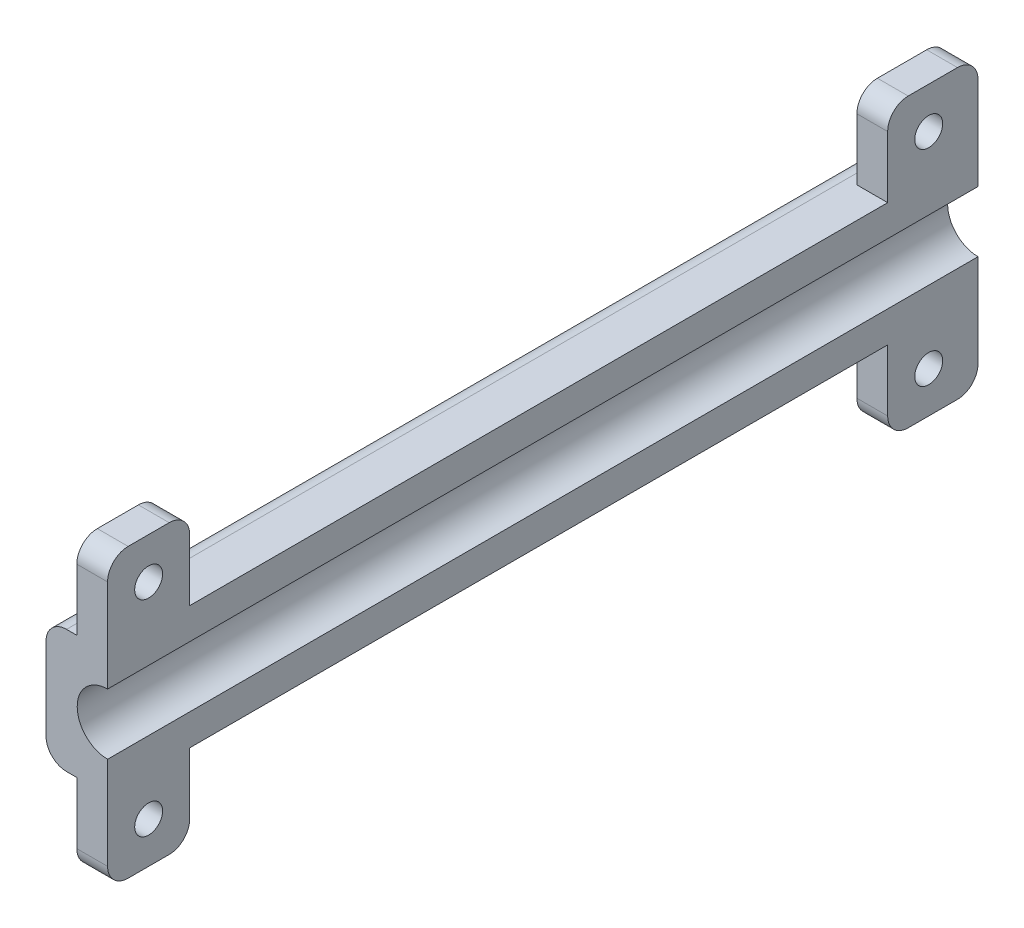
ISO-10303-21;
HEADER;
FILE_DESCRIPTION(('STEP AP214'),'2;1');
FILE_NAME('part.step','',(''),(''),'','','');
FILE_SCHEMA(('AUTOMOTIVE_DESIGN { 1 0 10303 214 1 1 1 1 }'));
ENDSEC;
DATA;
#1=APPLICATION_CONTEXT('core data for automotive mechanical design processes');
#2=APPLICATION_PROTOCOL_DEFINITION('international standard','automotive_design',2000,#1);
#3=PRODUCT_CONTEXT('',#1,'mechanical');
#4=PRODUCT('Part','Part','',(#3));
#5=PRODUCT_RELATED_PRODUCT_CATEGORY('part','',(#4));
#6=PRODUCT_DEFINITION_FORMATION('','',#4);
#7=PRODUCT_DEFINITION_CONTEXT('part definition',#1,'design');
#8=PRODUCT_DEFINITION('design','',#6,#7);
#9=PRODUCT_DEFINITION_SHAPE('','',#8);
#10=(LENGTH_UNIT() NAMED_UNIT(*) SI_UNIT(.MILLI.,.METRE.));
#11=(NAMED_UNIT(*) PLANE_ANGLE_UNIT() SI_UNIT($,.RADIAN.));
#12=(NAMED_UNIT(*) SI_UNIT($,.STERADIAN.) SOLID_ANGLE_UNIT());
#13=UNCERTAINTY_MEASURE_WITH_UNIT(LENGTH_MEASURE(1.E-05),#10,'distance_accuracy_value','');
#14=(GEOMETRIC_REPRESENTATION_CONTEXT(3) GLOBAL_UNCERTAINTY_ASSIGNED_CONTEXT((#13)) GLOBAL_UNIT_ASSIGNED_CONTEXT((#10,
#11,#12)) REPRESENTATION_CONTEXT('',''));
#15=CARTESIAN_POINT('',(0.,0.,0.));
#16=DIRECTION('',(0.,0.,1.));
#17=DIRECTION('',(1.,0.,0.));
#18=AXIS2_PLACEMENT_3D('',#15,#16,#17);
#19=CARTESIAN_POINT('',(2.74999999999999,7.49999999999998,-122.770509831248));
#20=DIRECTION('',(0.,0.,1.));
#21=DIRECTION('',(1.,0.,0.));
#22=AXIS2_PLACEMENT_3D('',#19,#20,#21);
#23=CYLINDRICAL_SURFACE('',#22,3.7);
#24=CARTESIAN_POINT('',(2.74999999999999,7.49999999999998,-106.));
#25=DIRECTION('',(0.,0.,-1.));
#26=DIRECTION('',(-1.,0.,0.));
#27=AXIS2_PLACEMENT_3D('',#24,#25,#26);
#28=CIRCLE('',#27,3.7);
#29=CARTESIAN_POINT('',(2.74999999999999,11.2,-106.));
#30=VERTEX_POINT('',#29);
#31=CARTESIAN_POINT('',(2.74999999999999,3.79999999999998,-106.));
#32=VERTEX_POINT('',#31);
#33=EDGE_CURVE('E421',#30,#32,#28,.F.);
#34=ORIENTED_EDGE('',*,*,#33,.F.);
#35=DIRECTION('',(0.,0.,1.));
#36=VECTOR('',#35,1.);
#37=CARTESIAN_POINT('',(2.74999999999999,11.2,-122.770509831248));
#38=LINE('',#37,#36);
#39=CARTESIAN_POINT('',(2.74999999999999,11.2,0.));
#40=VERTEX_POINT('',#39);
#41=EDGE_CURVE('E412',#30,#40,#38,.T.);
#42=ORIENTED_EDGE('',*,*,#41,.T.);
#43=CARTESIAN_POINT('',(2.74999999999999,7.49999999999998,0.));
#44=DIRECTION('',(0.,0.,1.));
#45=DIRECTION('',(1.,0.,0.));
#46=AXIS2_PLACEMENT_3D('',#43,#44,#45);
#47=CIRCLE('',#46,3.7);
#48=CARTESIAN_POINT('',(2.74999999999999,3.79999999999998,0.));
#49=VERTEX_POINT('',#48);
#50=EDGE_CURVE('E409',#40,#49,#47,.T.);
#51=ORIENTED_EDGE('',*,*,#50,.T.);
#52=DIRECTION('',(0.,0.,1.));
#53=VECTOR('',#52,1.);
#54=CARTESIAN_POINT('',(2.74999999999999,3.79999999999998,-122.770509831248));
#55=LINE('',#54,#53);
#56=EDGE_CURVE('E397',#32,#49,#55,.T.);
#57=ORIENTED_EDGE('',*,*,#56,.F.);
#58=EDGE_LOOP('',(#34,#42,#51,#57));
#59=FACE_BOUND('',#58,.T.);
#60=ADVANCED_FACE('F35',(#59),#23,.F.);
#61=CARTESIAN_POINT('',(2.74999999999999,0.,-122.770509831248));
#62=DIRECTION('',(-1.,0.,0.));
#63=DIRECTION('',(0.,0.,1.));
#64=AXIS2_PLACEMENT_3D('',#61,#62,#63);
#65=PLANE('',#64);
#66=DIRECTION('',(0.,-1.,0.));
#67=VECTOR('',#66,1.);
#68=CARTESIAN_POINT('',(2.74999999999999,0.,-106.));
#69=LINE('',#68,#67);
#70=CARTESIAN_POINT('',(2.74999999999999,-7.5,-106.));
#71=VERTEX_POINT('',#70);
#72=EDGE_CURVE('E418',#32,#71,#69,.T.);
#73=ORIENTED_EDGE('',*,*,#72,.F.);
#74=ORIENTED_EDGE('',*,*,#56,.T.);
#75=DIRECTION('',(0.,-1.,0.));
#76=VECTOR('',#75,1.);
#77=CARTESIAN_POINT('',(2.74999999999999,0.,0.));
#78=LINE('',#77,#76);
#79=CARTESIAN_POINT('',(2.74999999999999,-7.5,0.));
#80=VERTEX_POINT('',#79);
#81=EDGE_CURVE('E394',#49,#80,#78,.T.);
#82=ORIENTED_EDGE('',*,*,#81,.T.);
#83=CARTESIAN_POINT('',(2.74999999999999,-7.5,-2.5));
#84=DIRECTION('',(-1.,0.,0.));
#85=DIRECTION('',(0.,0.,1.));
#86=AXIS2_PLACEMENT_3D('',#83,#84,#85);
#87=CIRCLE('',#86,2.5);
#88=CARTESIAN_POINT('',(2.74999999999999,-10.,-2.5));
#89=VERTEX_POINT('',#88);
#90=EDGE_CURVE('E327',#89,#80,#87,.T.);
#91=ORIENTED_EDGE('',*,*,#90,.F.);
#92=DIRECTION('',(0.,0.,1.));
#93=VECTOR('',#92,1.);
#94=CARTESIAN_POINT('',(2.74999999999999,-10.,-7.49999999999999));
#95=LINE('',#94,#93);
#96=CARTESIAN_POINT('',(2.74999999999999,-10.,-7.49999999999999));
#97=VERTEX_POINT('',#96);
#98=EDGE_CURVE('E358',#97,#89,#95,.T.);
#99=ORIENTED_EDGE('',*,*,#98,.F.);
#100=CARTESIAN_POINT('',(2.74999999999999,-7.5,-7.50000000000001));
#101=DIRECTION('',(-1.,0.,0.));
#102=DIRECTION('',(0.,0.,1.));
#103=AXIS2_PLACEMENT_3D('',#100,#101,#102);
#104=CIRCLE('',#103,2.5);
#105=CARTESIAN_POINT('',(2.74999999999999,-7.5,-10.));
#106=VERTEX_POINT('',#105);
#107=EDGE_CURVE('E356',#106,#97,#104,.T.);
#108=ORIENTED_EDGE('',*,*,#107,.F.);
#109=DIRECTION('',(0.,-1.,0.));
#110=VECTOR('',#109,1.);
#111=CARTESIAN_POINT('',(2.74999999999999,0.,-10.));
#112=LINE('',#111,#110);
#113=CARTESIAN_POINT('',(2.74999999999999,0.,-10.));
#114=VERTEX_POINT('',#113);
#115=EDGE_CURVE('E354',#114,#106,#112,.T.);
#116=ORIENTED_EDGE('',*,*,#115,.F.);
#117=DIRECTION('',(0.,0.,1.));
#118=VECTOR('',#117,1.);
#119=CARTESIAN_POINT('',(2.74999999999999,0.,-122.770509831248));
#120=LINE('',#119,#118);
#121=CARTESIAN_POINT('',(2.74999999999999,0.,-95.));
#122=VERTEX_POINT('',#121);
#123=EDGE_CURVE('E405',#122,#114,#120,.T.);
#124=ORIENTED_EDGE('',*,*,#123,.F.);
#125=DIRECTION('',(0.,1.,0.));
#126=VECTOR('',#125,1.);
#127=CARTESIAN_POINT('',(2.74999999999999,-7.5,-95.));
#128=LINE('',#127,#126);
#129=CARTESIAN_POINT('',(2.74999999999999,-7.5,-95.));
#130=VERTEX_POINT('',#129);
#131=EDGE_CURVE('E352',#130,#122,#128,.T.);
#132=ORIENTED_EDGE('',*,*,#131,.F.);
#133=CARTESIAN_POINT('',(2.74999999999999,-7.5,-97.5));
#134=DIRECTION('',(-1.,0.,0.));
#135=DIRECTION('',(0.,0.,1.));
#136=AXIS2_PLACEMENT_3D('',#133,#134,#135);
#137=CIRCLE('',#136,2.5);
#138=CARTESIAN_POINT('',(2.74999999999999,-10.,-97.5));
#139=VERTEX_POINT('',#138);
#140=EDGE_CURVE('E350',#139,#130,#137,.T.);
#141=ORIENTED_EDGE('',*,*,#140,.F.);
#142=DIRECTION('',(0.,0.,1.));
#143=VECTOR('',#142,1.);
#144=CARTESIAN_POINT('',(2.74999999999999,-10.,-103.5));
#145=LINE('',#144,#143);
#146=CARTESIAN_POINT('',(2.74999999999999,-10.,-103.5));
#147=VERTEX_POINT('',#146);
#148=EDGE_CURVE('E348',#147,#139,#145,.T.);
#149=ORIENTED_EDGE('',*,*,#148,.F.);
#150=CARTESIAN_POINT('',(2.74999999999999,-7.5,-103.5));
#151=DIRECTION('',(-1.,0.,0.));
#152=DIRECTION('',(0.,0.,1.));
#153=AXIS2_PLACEMENT_3D('',#150,#151,#152);
#154=CIRCLE('',#153,2.5);
#155=EDGE_CURVE('E321',#71,#147,#154,.T.);
#156=ORIENTED_EDGE('',*,*,#155,.F.);
#157=EDGE_LOOP('',(#73,#74,#82,#91,#99,#108,#116,#124,#132,#141,#149,#156));
#158=FACE_BOUND('',#157,.T.);
#159=CARTESIAN_POINT('',(2.74999999999999,-5.,-100.));
#160=DIRECTION('',(-1.,0.,0.));
#161=DIRECTION('',(0.,0.,1.));
#162=AXIS2_PLACEMENT_3D('',#159,#160,#161);
#163=CIRCLE('',#162,1.70000000000001);
#164=CARTESIAN_POINT('',(2.74999999999999,-5.,-98.3));
#165=VERTEX_POINT('',#164);
#166=EDGE_CURVE('E315',#165,#165,#163,.T.);
#167=ORIENTED_EDGE('',*,*,#166,.T.);
#168=EDGE_LOOP('',(#167));
#169=FACE_BOUND('',#168,.T.);
#170=CARTESIAN_POINT('',(2.74999999999999,-5.,-5.));
#171=DIRECTION('',(-1.,0.,0.));
#172=DIRECTION('',(0.,0.,1.));
#173=AXIS2_PLACEMENT_3D('',#170,#171,#172);
#174=CIRCLE('',#173,1.70000000000001);
#175=CARTESIAN_POINT('',(2.74999999999999,-5.,-3.3));
#176=VERTEX_POINT('',#175);
#177=EDGE_CURVE('E314',#176,#176,#174,.T.);
#178=ORIENTED_EDGE('',*,*,#177,.T.);
#179=EDGE_LOOP('',(#178));
#180=FACE_BOUND('',#179,.T.);
#181=ADVANCED_FACE('F527',(#158,#169,#180),#65,.F.);
#182=CARTESIAN_POINT('',(0.,0.,-122.770509831248));
#183=DIRECTION('',(0.,-1.,0.));
#184=DIRECTION('',(0.,0.,-1.));
#185=AXIS2_PLACEMENT_3D('',#182,#183,#184);
#186=PLANE('',#185);
#187=DIRECTION('',(1.,0.,0.));
#188=VECTOR('',#187,1.);
#189=CARTESIAN_POINT('',(0.,0.,0.));
#190=LINE('',#189,#188);
#191=CARTESIAN_POINT('',(-2.25000000000001,0.,0.));
#192=VERTEX_POINT('',#191);
#193=CARTESIAN_POINT('',(-1.00000000000001,0.,0.));
#194=VERTEX_POINT('',#193);
#195=EDGE_CURVE('E398',#192,#194,#190,.T.);
#196=ORIENTED_EDGE('',*,*,#195,.F.);
#197=DIRECTION('',(0.,0.,1.));
#198=VECTOR('',#197,1.);
#199=CARTESIAN_POINT('',(-2.25000000000001,0.,-106.));
#200=LINE('',#199,#198);
#201=CARTESIAN_POINT('',(-2.25000000000001,0.,-106.));
#202=VERTEX_POINT('',#201);
#203=EDGE_CURVE('E58',#192,#202,#200,.F.);
#204=ORIENTED_EDGE('',*,*,#203,.T.);
#205=DIRECTION('',(1.,0.,0.));
#206=VECTOR('',#205,1.);
#207=CARTESIAN_POINT('',(0.,0.,-106.));
#208=LINE('',#207,#206);
#209=CARTESIAN_POINT('',(-1.00000000000001,0.,-106.));
#210=VERTEX_POINT('',#209);
#211=EDGE_CURVE('E396',#202,#210,#208,.T.);
#212=ORIENTED_EDGE('',*,*,#211,.T.);
#213=DIRECTION('',(0.,0.,-1.));
#214=VECTOR('',#213,1.);
#215=CARTESIAN_POINT('',(-1.00000000000001,0.,-122.770509831248));
#216=LINE('',#215,#214);
#217=CARTESIAN_POINT('',(-1.00000000000001,0.,-95.));
#218=VERTEX_POINT('',#217);
#219=EDGE_CURVE('E390',#218,#210,#216,.T.);
#220=ORIENTED_EDGE('',*,*,#219,.F.);
#221=DIRECTION('',(1.,0.,0.));
#222=VECTOR('',#221,1.);
#223=CARTESIAN_POINT('',(-1.00000000000001,0.,-95.));
#224=LINE('',#223,#222);
#225=EDGE_CURVE('E375',#218,#122,#224,.T.);
#226=ORIENTED_EDGE('',*,*,#225,.T.);
#227=ORIENTED_EDGE('',*,*,#123,.T.);
#228=DIRECTION('',(1.,0.,0.));
#229=VECTOR('',#228,1.);
#230=CARTESIAN_POINT('',(-1.00000000000001,0.,-10.));
#231=LINE('',#230,#229);
#232=CARTESIAN_POINT('',(-1.00000000000001,0.,-10.));
#233=VERTEX_POINT('',#232);
#234=EDGE_CURVE('E373',#233,#114,#231,.T.);
#235=ORIENTED_EDGE('',*,*,#234,.F.);
#236=EDGE_CURVE('E393',#194,#233,#216,.T.);
#237=ORIENTED_EDGE('',*,*,#236,.F.);
#238=EDGE_LOOP('',(#196,#204,#212,#220,#226,#227,#235,#237));
#239=FACE_BOUND('',#238,.T.);
#240=ADVANCED_FACE('F453',(#239),#186,.T.);
#241=CARTESIAN_POINT('',(-4.75000000000001,0.,-122.770509831248));
#242=DIRECTION('',(1.,0.,0.));
#243=DIRECTION('',(0.,0.,-1.));
#244=AXIS2_PLACEMENT_3D('',#241,#242,#243);
#245=PLANE('',#244);
#246=DIRECTION('',(0.,1.,0.));
#247=VECTOR('',#246,1.);
#248=CARTESIAN_POINT('',(-4.75000000000001,0.,-106.));
#249=LINE('',#248,#247);
#250=CARTESIAN_POINT('',(-4.75000000000001,2.5,-106.));
#251=VERTEX_POINT('',#250);
#252=CARTESIAN_POINT('',(-4.75000000000001,12.5,-106.));
#253=VERTEX_POINT('',#252);
#254=EDGE_CURVE('E416',#251,#253,#249,.T.);
#255=ORIENTED_EDGE('',*,*,#254,.F.);
#256=DIRECTION('',(0.,0.,1.));
#257=VECTOR('',#256,1.);
#258=CARTESIAN_POINT('',(-4.75000000000001,2.5,0.));
#259=LINE('',#258,#257);
#260=CARTESIAN_POINT('',(-4.75000000000001,2.5,0.));
#261=VERTEX_POINT('',#260);
#262=EDGE_CURVE('E433',#251,#261,#259,.T.);
#263=ORIENTED_EDGE('',*,*,#262,.T.);
#264=DIRECTION('',(0.,1.,0.));
#265=VECTOR('',#264,1.);
#266=CARTESIAN_POINT('',(-4.75000000000001,0.,0.));
#267=LINE('',#266,#265);
#268=CARTESIAN_POINT('',(-4.75000000000001,12.5,0.));
#269=VERTEX_POINT('',#268);
#270=EDGE_CURVE('E401',#261,#269,#267,.T.);
#271=ORIENTED_EDGE('',*,*,#270,.T.);
#272=DIRECTION('',(0.,0.,1.));
#273=VECTOR('',#272,1.);
#274=CARTESIAN_POINT('',(-4.75000000000001,12.5,-122.770509831248));
#275=LINE('',#274,#273);
#276=EDGE_CURVE('E415',#269,#253,#275,.F.);
#277=ORIENTED_EDGE('',*,*,#276,.T.);
#278=EDGE_LOOP('',(#255,#263,#271,#277));
#279=FACE_BOUND('',#278,.T.);
#280=ADVANCED_FACE('F448',(#279),#245,.F.);
#281=CARTESIAN_POINT('',(0.,15.,-122.770509831248));
#282=DIRECTION('',(0.,-1.,0.));
#283=DIRECTION('',(0.,0.,-1.));
#284=AXIS2_PLACEMENT_3D('',#281,#282,#283);
#285=PLANE('',#284);
#286=DIRECTION('',(1.,0.,0.));
#287=VECTOR('',#286,1.);
#288=CARTESIAN_POINT('',(0.,15.,-106.));
#289=LINE('',#288,#287);
#290=CARTESIAN_POINT('',(-2.25000000000001,15.,-106.));
#291=VERTEX_POINT('',#290);
#292=CARTESIAN_POINT('',(-1.00000000000001,15.,-106.));
#293=VERTEX_POINT('',#292);
#294=EDGE_CURVE('E413',#291,#293,#289,.T.);
#295=ORIENTED_EDGE('',*,*,#294,.F.);
#296=DIRECTION('',(0.,0.,1.));
#297=VECTOR('',#296,1.);
#298=CARTESIAN_POINT('',(-2.25000000000001,15.,-122.770509831248));
#299=LINE('',#298,#297);
#300=CARTESIAN_POINT('',(-2.25000000000001,15.,0.));
#301=VERTEX_POINT('',#300);
#302=EDGE_CURVE('E11',#291,#301,#299,.T.);
#303=ORIENTED_EDGE('',*,*,#302,.T.);
#304=DIRECTION('',(1.,0.,0.));
#305=VECTOR('',#304,1.);
#306=CARTESIAN_POINT('',(0.,15.,0.));
#307=LINE('',#306,#305);
#308=CARTESIAN_POINT('',(-1.00000000000001,15.,0.));
#309=VERTEX_POINT('',#308);
#310=EDGE_CURVE('E404',#301,#309,#307,.T.);
#311=ORIENTED_EDGE('',*,*,#310,.T.);
#312=DIRECTION('',(0.,0.,-1.));
#313=VECTOR('',#312,1.);
#314=CARTESIAN_POINT('',(-1.00000000000001,15.,-122.770509831248));
#315=LINE('',#314,#313);
#316=CARTESIAN_POINT('',(-1.00000000000001,15.,-10.));
#317=VERTEX_POINT('',#316);
#318=EDGE_CURVE('E229',#309,#317,#315,.T.);
#319=ORIENTED_EDGE('',*,*,#318,.T.);
#320=DIRECTION('',(1.,0.,0.));
#321=VECTOR('',#320,1.);
#322=CARTESIAN_POINT('',(-1.00000000000001,15.,-10.));
#323=LINE('',#322,#321);
#324=CARTESIAN_POINT('',(2.74999999999999,15.,-10.));
#325=VERTEX_POINT('',#324);
#326=EDGE_CURVE('E300',#317,#325,#323,.T.);
#327=ORIENTED_EDGE('',*,*,#326,.T.);
#328=DIRECTION('',(0.,0.,1.));
#329=VECTOR('',#328,1.);
#330=CARTESIAN_POINT('',(2.74999999999999,15.,-122.770509831248));
#331=LINE('',#330,#329);
#332=CARTESIAN_POINT('',(2.74999999999999,15.,-95.));
#333=VERTEX_POINT('',#332);
#334=EDGE_CURVE('E407',#333,#325,#331,.T.);
#335=ORIENTED_EDGE('',*,*,#334,.F.);
#336=DIRECTION('',(1.,0.,0.));
#337=VECTOR('',#336,1.);
#338=CARTESIAN_POINT('',(-1.00000000000001,15.,-95.));
#339=LINE('',#338,#337);
#340=CARTESIAN_POINT('',(-1.00000000000001,15.,-95.));
#341=VERTEX_POINT('',#340);
#342=EDGE_CURVE('E297',#341,#333,#339,.T.);
#343=ORIENTED_EDGE('',*,*,#342,.F.);
#344=EDGE_CURVE('E243',#341,#293,#315,.T.);
#345=ORIENTED_EDGE('',*,*,#344,.T.);
#346=EDGE_LOOP('',(#295,#303,#311,#319,#327,#335,#343,#345));
#347=FACE_BOUND('',#346,.T.);
#348=ADVANCED_FACE('F500',(#347),#285,.F.);
#349=CARTESIAN_POINT('',(2.74999999999999,0.,-122.770509831248));
#350=DIRECTION('',(-1.,0.,0.));
#351=DIRECTION('',(0.,0.,1.));
#352=AXIS2_PLACEMENT_3D('',#349,#350,#351);
#353=PLANE('',#352);
#354=DIRECTION('',(0.,-1.,0.));
#355=VECTOR('',#354,1.);
#356=CARTESIAN_POINT('',(2.74999999999999,0.,-106.));
#357=LINE('',#356,#355);
#358=CARTESIAN_POINT('',(2.74999999999999,22.5,-106.));
#359=VERTEX_POINT('',#358);
#360=EDGE_CURVE('E400',#359,#30,#357,.T.);
#361=ORIENTED_EDGE('',*,*,#360,.F.);
#362=CARTESIAN_POINT('',(2.74999999999999,22.5,-103.5));
#363=DIRECTION('',(-1.,0.,0.));
#364=DIRECTION('',(0.,0.,1.));
#365=AXIS2_PLACEMENT_3D('',#362,#363,#364);
#366=CIRCLE('',#365,2.5);
#367=CARTESIAN_POINT('',(2.74999999999999,25.,-103.5));
#368=VERTEX_POINT('',#367);
#369=EDGE_CURVE('E283',#368,#359,#366,.T.);
#370=ORIENTED_EDGE('',*,*,#369,.F.);
#371=DIRECTION('',(0.,0.,-1.));
#372=VECTOR('',#371,1.);
#373=CARTESIAN_POINT('',(2.74999999999999,25.,-97.5));
#374=LINE('',#373,#372);
#375=CARTESIAN_POINT('',(2.74999999999999,25.,-97.5));
#376=VERTEX_POINT('',#375);
#377=EDGE_CURVE('E281',#376,#368,#374,.T.);
#378=ORIENTED_EDGE('',*,*,#377,.F.);
#379=CARTESIAN_POINT('',(2.74999999999999,22.5,-97.5));
#380=DIRECTION('',(-1.,0.,0.));
#381=DIRECTION('',(0.,0.,1.));
#382=AXIS2_PLACEMENT_3D('',#379,#380,#381);
#383=CIRCLE('',#382,2.5);
#384=CARTESIAN_POINT('',(2.74999999999999,22.5,-95.));
#385=VERTEX_POINT('',#384);
#386=EDGE_CURVE('E279',#385,#376,#383,.T.);
#387=ORIENTED_EDGE('',*,*,#386,.F.);
#388=DIRECTION('',(0.,1.,0.));
#389=VECTOR('',#388,1.);
#390=CARTESIAN_POINT('',(2.74999999999999,15.,-95.));
#391=LINE('',#390,#389);
#392=EDGE_CURVE('E277',#333,#385,#391,.T.);
#393=ORIENTED_EDGE('',*,*,#392,.F.);
#394=ORIENTED_EDGE('',*,*,#334,.T.);
#395=DIRECTION('',(0.,-1.,0.));
#396=VECTOR('',#395,1.);
#397=CARTESIAN_POINT('',(2.74999999999999,22.5,-10.));
#398=LINE('',#397,#396);
#399=CARTESIAN_POINT('',(2.74999999999999,22.5,-10.));
#400=VERTEX_POINT('',#399);
#401=EDGE_CURVE('E274',#400,#325,#398,.T.);
#402=ORIENTED_EDGE('',*,*,#401,.F.);
#403=CARTESIAN_POINT('',(2.74999999999999,22.5,-7.50000000000001));
#404=DIRECTION('',(-1.,0.,0.));
#405=DIRECTION('',(0.,0.,1.));
#406=AXIS2_PLACEMENT_3D('',#403,#404,#405);
#407=CIRCLE('',#406,2.5);
#408=CARTESIAN_POINT('',(2.74999999999999,25.,-7.50000000000001));
#409=VERTEX_POINT('',#408);
#410=EDGE_CURVE('E272',#409,#400,#407,.T.);
#411=ORIENTED_EDGE('',*,*,#410,.F.);
#412=DIRECTION('',(0.,0.,-1.));
#413=VECTOR('',#412,1.);
#414=CARTESIAN_POINT('',(2.74999999999999,25.,-2.5));
#415=LINE('',#414,#413);
#416=CARTESIAN_POINT('',(2.74999999999999,25.,-2.5));
#417=VERTEX_POINT('',#416);
#418=EDGE_CURVE('E269',#417,#409,#415,.T.);
#419=ORIENTED_EDGE('',*,*,#418,.F.);
#420=CARTESIAN_POINT('',(2.74999999999999,22.5,-2.5));
#421=DIRECTION('',(-1.,0.,0.));
#422=DIRECTION('',(0.,0.,1.));
#423=AXIS2_PLACEMENT_3D('',#420,#421,#422);
#424=CIRCLE('',#423,2.5);
#425=CARTESIAN_POINT('',(2.74999999999999,22.5,0.));
#426=VERTEX_POINT('',#425);
#427=EDGE_CURVE('E267',#426,#417,#424,.T.);
#428=ORIENTED_EDGE('',*,*,#427,.F.);
#429=DIRECTION('',(0.,-1.,0.));
#430=VECTOR('',#429,1.);
#431=CARTESIAN_POINT('',(2.74999999999999,0.,0.));
#432=LINE('',#431,#430);
#433=EDGE_CURVE('E240',#426,#40,#432,.T.);
#434=ORIENTED_EDGE('',*,*,#433,.T.);
#435=ORIENTED_EDGE('',*,*,#41,.F.);
#436=EDGE_LOOP('',(#361,#370,#378,#387,#393,#394,#402,#411,#419,#428,#434,#435));
#437=FACE_BOUND('',#436,.T.);
#438=CARTESIAN_POINT('',(2.74999999999999,20.,-100.));
#439=DIRECTION('',(-1.,0.,0.));
#440=DIRECTION('',(0.,0.,1.));
#441=AXIS2_PLACEMENT_3D('',#438,#439,#440);
#442=CIRCLE('',#441,1.70000000000001);
#443=CARTESIAN_POINT('',(2.74999999999999,20.,-98.3));
#444=VERTEX_POINT('',#443);
#445=EDGE_CURVE('E850',#444,#444,#442,.T.);
#446=ORIENTED_EDGE('',*,*,#445,.T.);
#447=EDGE_LOOP('',(#446));
#448=FACE_BOUND('',#447,.T.);
#449=CARTESIAN_POINT('',(2.74999999999999,20.,-5.));
#450=DIRECTION('',(-1.,0.,0.));
#451=DIRECTION('',(0.,0.,1.));
#452=AXIS2_PLACEMENT_3D('',#449,#450,#451);
#453=CIRCLE('',#452,1.70000000000001);
#454=CARTESIAN_POINT('',(2.74999999999999,20.,-3.3));
#455=VERTEX_POINT('',#454);
#456=EDGE_CURVE('E844',#455,#455,#453,.T.);
#457=ORIENTED_EDGE('',*,*,#456,.T.);
#458=EDGE_LOOP('',(#457));
#459=FACE_BOUND('',#458,.T.);
#460=ADVANCED_FACE('F483',(#437,#448,#459),#353,.F.);
#461=CARTESIAN_POINT('',(0.,0.,0.));
#462=DIRECTION('',(0.,0.,1.));
#463=DIRECTION('',(1.,0.,0.));
#464=AXIS2_PLACEMENT_3D('',#461,#462,#463);
#465=PLANE('',#464);
#466=ORIENTED_EDGE('',*,*,#270,.F.);
#467=CARTESIAN_POINT('',(-2.25000000000001,2.5,0.));
#468=DIRECTION('',(0.,0.,1.));
#469=DIRECTION('',(1.,0.,0.));
#470=AXIS2_PLACEMENT_3D('',#467,#468,#469);
#471=CIRCLE('',#470,2.5);
#472=EDGE_CURVE('E438',#261,#192,#471,.T.);
#473=ORIENTED_EDGE('',*,*,#472,.T.);
#474=ORIENTED_EDGE('',*,*,#195,.T.);
#475=DIRECTION('',(0.,1.,0.));
#476=VECTOR('',#475,1.);
#477=CARTESIAN_POINT('',(-1.00000000000001,-7.5,0.));
#478=LINE('',#477,#476);
#479=CARTESIAN_POINT('',(-1.00000000000001,-7.5,0.));
#480=VERTEX_POINT('',#479);
#481=EDGE_CURVE('E343',#480,#194,#478,.T.);
#482=ORIENTED_EDGE('',*,*,#481,.F.);
#483=DIRECTION('',(1.,0.,0.));
#484=VECTOR('',#483,1.);
#485=CARTESIAN_POINT('',(-1.00000000000001,-7.5,0.));
#486=LINE('',#485,#484);
#487=EDGE_CURVE('E346',#480,#80,#486,.T.);
#488=ORIENTED_EDGE('',*,*,#487,.T.);
#489=ORIENTED_EDGE('',*,*,#81,.F.);
#490=ORIENTED_EDGE('',*,*,#50,.F.);
#491=ORIENTED_EDGE('',*,*,#433,.F.);
#492=DIRECTION('',(1.,0.,0.));
#493=VECTOR('',#492,1.);
#494=CARTESIAN_POINT('',(-1.00000000000001,22.5,0.));
#495=LINE('',#494,#493);
#496=CARTESIAN_POINT('',(-1.00000000000001,22.5,0.));
#497=VERTEX_POINT('',#496);
#498=EDGE_CURVE('E235',#497,#426,#495,.T.);
#499=ORIENTED_EDGE('',*,*,#498,.F.);
#500=DIRECTION('',(0.,1.,0.));
#501=VECTOR('',#500,1.);
#502=CARTESIAN_POINT('',(-1.00000000000001,11.2,0.));
#503=LINE('',#502,#501);
#504=EDGE_CURVE('E222',#309,#497,#503,.T.);
#505=ORIENTED_EDGE('',*,*,#504,.F.);
#506=ORIENTED_EDGE('',*,*,#310,.F.);
#507=CARTESIAN_POINT('',(-2.25000000000001,12.5,0.));
#508=DIRECTION('',(0.,0.,1.));
#509=DIRECTION('',(1.,0.,0.));
#510=AXIS2_PLACEMENT_3D('',#507,#508,#509);
#511=CIRCLE('',#510,2.5);
#512=EDGE_CURVE('E436',#301,#269,#511,.T.);
#513=ORIENTED_EDGE('',*,*,#512,.T.);
#514=EDGE_LOOP('',(#466,#473,#474,#482,#488,#489,#490,#491,#499,#505,#506,#513));
#515=FACE_BOUND('',#514,.T.);
#516=ADVANCED_FACE('F237',(#515),#465,.T.);
#517=CARTESIAN_POINT('',(2.74999999999999,7.49999999999998,-106.));
#518=DIRECTION('',(0.,0.,-1.));
#519=DIRECTION('',(-1.,0.,0.));
#520=AXIS2_PLACEMENT_3D('',#517,#518,#519);
#521=PLANE('',#520);
#522=ORIENTED_EDGE('',*,*,#211,.F.);
#523=CARTESIAN_POINT('',(-2.25000000000001,2.5,-106.));
#524=DIRECTION('',(0.,0.,-1.));
#525=DIRECTION('',(-1.,0.,0.));
#526=AXIS2_PLACEMENT_3D('',#523,#524,#525);
#527=CIRCLE('',#526,2.5);
#528=EDGE_CURVE('E43',#202,#251,#527,.T.);
#529=ORIENTED_EDGE('',*,*,#528,.T.);
#530=ORIENTED_EDGE('',*,*,#254,.T.);
#531=CARTESIAN_POINT('',(-2.25000000000001,12.5,-106.));
#532=DIRECTION('',(0.,0.,-1.));
#533=DIRECTION('',(-1.,0.,0.));
#534=AXIS2_PLACEMENT_3D('',#531,#532,#533);
#535=CIRCLE('',#534,2.5);
#536=EDGE_CURVE('E50',#253,#291,#535,.T.);
#537=ORIENTED_EDGE('',*,*,#536,.T.);
#538=ORIENTED_EDGE('',*,*,#294,.T.);
#539=DIRECTION('',(0.,-1.,0.));
#540=VECTOR('',#539,1.);
#541=CARTESIAN_POINT('',(-1.00000000000001,22.5,-106.));
#542=LINE('',#541,#540);
#543=CARTESIAN_POINT('',(-1.00000000000001,22.5,-106.));
#544=VERTEX_POINT('',#543);
#545=EDGE_CURVE('E232',#544,#293,#542,.T.);
#546=ORIENTED_EDGE('',*,*,#545,.F.);
#547=DIRECTION('',(1.,0.,0.));
#548=VECTOR('',#547,1.);
#549=CARTESIAN_POINT('',(-1.00000000000001,22.5,-106.));
#550=LINE('',#549,#548);
#551=EDGE_CURVE('E266',#544,#359,#550,.T.);
#552=ORIENTED_EDGE('',*,*,#551,.T.);
#553=ORIENTED_EDGE('',*,*,#360,.T.);
#554=ORIENTED_EDGE('',*,*,#33,.T.);
#555=ORIENTED_EDGE('',*,*,#72,.T.);
#556=DIRECTION('',(1.,0.,0.));
#557=VECTOR('',#556,1.);
#558=CARTESIAN_POINT('',(-1.00000000000001,-7.5,-106.));
#559=LINE('',#558,#557);
#560=CARTESIAN_POINT('',(-1.00000000000001,-7.5,-106.));
#561=VERTEX_POINT('',#560);
#562=EDGE_CURVE('E387',#561,#71,#559,.T.);
#563=ORIENTED_EDGE('',*,*,#562,.F.);
#564=DIRECTION('',(0.,-1.,0.));
#565=VECTOR('',#564,1.);
#566=CARTESIAN_POINT('',(-1.00000000000001,3.79999999999998,-106.));
#567=LINE('',#566,#565);
#568=EDGE_CURVE('E324',#210,#561,#567,.T.);
#569=ORIENTED_EDGE('',*,*,#568,.F.);
#570=EDGE_LOOP('',(#522,#529,#530,#537,#538,#546,#552,#553,#554,#555,#563,#569));
#571=FACE_BOUND('',#570,.T.);
#572=ADVANCED_FACE('F443',(#571),#521,.T.);
#573=CARTESIAN_POINT('',(-1.00000000000001,-5.,-5.));
#574=DIRECTION('',(1.,0.,0.));
#575=DIRECTION('',(0.,0.,-1.));
#576=AXIS2_PLACEMENT_3D('',#573,#574,#575);
#577=CYLINDRICAL_SURFACE('',#576,1.70000000000001);
#578=CARTESIAN_POINT('',(-1.00000000000001,-5.,-5.));
#579=DIRECTION('',(-1.,0.,0.));
#580=DIRECTION('',(0.,0.,1.));
#581=AXIS2_PLACEMENT_3D('',#578,#579,#580);
#582=CIRCLE('',#581,1.70000000000001);
#583=CARTESIAN_POINT('',(-1.00000000000001,-5.,-3.3));
#584=VERTEX_POINT('',#583);
#585=EDGE_CURVE('E318',#584,#584,#582,.T.);
#586=ORIENTED_EDGE('',*,*,#585,.T.);
#587=EDGE_LOOP('',(#586));
#588=FACE_BOUND('',#587,.T.);
#589=ORIENTED_EDGE('',*,*,#177,.F.);
#590=EDGE_LOOP('',(#589));
#591=FACE_BOUND('',#590,.T.);
#592=ADVANCED_FACE('F536',(#588,#591),#577,.F.);
#593=CARTESIAN_POINT('',(-1.00000000000001,-7.5,-2.5));
#594=DIRECTION('',(1.,0.,0.));
#595=DIRECTION('',(0.,0.,-1.));
#596=AXIS2_PLACEMENT_3D('',#593,#594,#595);
#597=CYLINDRICAL_SURFACE('',#596,2.5);
#598=ORIENTED_EDGE('',*,*,#90,.T.);
#599=ORIENTED_EDGE('',*,*,#487,.F.);
#600=CARTESIAN_POINT('',(-1.00000000000001,-7.5,-2.5));
#601=DIRECTION('',(-1.,0.,0.));
#602=DIRECTION('',(0.,0.,1.));
#603=AXIS2_PLACEMENT_3D('',#600,#601,#602);
#604=CIRCLE('',#603,2.5);
#605=CARTESIAN_POINT('',(-1.00000000000001,-10.,-2.5));
#606=VERTEX_POINT('',#605);
#607=EDGE_CURVE('E341',#606,#480,#604,.T.);
#608=ORIENTED_EDGE('',*,*,#607,.F.);
#609=DIRECTION('',(1.,0.,0.));
#610=VECTOR('',#609,1.);
#611=CARTESIAN_POINT('',(-1.00000000000001,-10.,-2.5));
#612=LINE('',#611,#610);
#613=EDGE_CURVE('E364',#606,#89,#612,.T.);
#614=ORIENTED_EDGE('',*,*,#613,.T.);
#615=EDGE_LOOP('',(#598,#599,#608,#614));
#616=FACE_BOUND('',#615,.T.);
#617=ADVANCED_FACE('F476',(#616),#597,.T.);
#618=CARTESIAN_POINT('',(-1.00000000000001,-10.,-7.49999999999999));
#619=DIRECTION('',(0.,1.,0.));
#620=DIRECTION('',(0.,0.,1.));
#621=AXIS2_PLACEMENT_3D('',#618,#619,#620);
#622=PLANE('',#621);
#623=ORIENTED_EDGE('',*,*,#98,.T.);
#624=ORIENTED_EDGE('',*,*,#613,.F.);
#625=DIRECTION('',(0.,0.,1.));
#626=VECTOR('',#625,1.);
#627=CARTESIAN_POINT('',(-1.00000000000001,-10.,-7.49999999999999));
#628=LINE('',#627,#626);
#629=CARTESIAN_POINT('',(-1.00000000000001,-10.,-7.49999999999999));
#630=VERTEX_POINT('',#629);
#631=EDGE_CURVE('E339',#630,#606,#628,.T.);
#632=ORIENTED_EDGE('',*,*,#631,.F.);
#633=DIRECTION('',(1.,0.,0.));
#634=VECTOR('',#633,1.);
#635=CARTESIAN_POINT('',(-1.00000000000001,-10.,-7.49999999999999));
#636=LINE('',#635,#634);
#637=EDGE_CURVE('E367',#630,#97,#636,.T.);
#638=ORIENTED_EDGE('',*,*,#637,.T.);
#639=EDGE_LOOP('',(#623,#624,#632,#638));
#640=FACE_BOUND('',#639,.T.);
#641=ADVANCED_FACE('F472',(#640),#622,.F.);
#642=CARTESIAN_POINT('',(-1.00000000000001,-7.5,-7.50000000000001));
#643=DIRECTION('',(1.,0.,0.));
#644=DIRECTION('',(0.,0.,-1.));
#645=AXIS2_PLACEMENT_3D('',#642,#643,#644);
#646=CYLINDRICAL_SURFACE('',#645,2.5);
#647=ORIENTED_EDGE('',*,*,#107,.T.);
#648=ORIENTED_EDGE('',*,*,#637,.F.);
#649=CARTESIAN_POINT('',(-1.00000000000001,-7.5,-7.50000000000001));
#650=DIRECTION('',(-1.,0.,0.));
#651=DIRECTION('',(0.,0.,1.));
#652=AXIS2_PLACEMENT_3D('',#649,#650,#651);
#653=CIRCLE('',#652,2.5);
#654=CARTESIAN_POINT('',(-1.00000000000001,-7.5,-10.));
#655=VERTEX_POINT('',#654);
#656=EDGE_CURVE('E337',#655,#630,#653,.T.);
#657=ORIENTED_EDGE('',*,*,#656,.F.);
#658=DIRECTION('',(1.,0.,0.));
#659=VECTOR('',#658,1.);
#660=CARTESIAN_POINT('',(-1.00000000000001,-7.5,-10.));
#661=LINE('',#660,#659);
#662=EDGE_CURVE('E370',#655,#106,#661,.T.);
#663=ORIENTED_EDGE('',*,*,#662,.T.);
#664=EDGE_LOOP('',(#647,#648,#657,#663));
#665=FACE_BOUND('',#664,.T.);
#666=ADVANCED_FACE('F466',(#665),#646,.T.);
#667=CARTESIAN_POINT('',(-1.00000000000001,0.,-10.));
#668=DIRECTION('',(0.,0.,1.));
#669=DIRECTION('',(1.,0.,0.));
#670=AXIS2_PLACEMENT_3D('',#667,#668,#669);
#671=PLANE('',#670);
#672=ORIENTED_EDGE('',*,*,#115,.T.);
#673=ORIENTED_EDGE('',*,*,#662,.F.);
#674=DIRECTION('',(0.,-1.,0.));
#675=VECTOR('',#674,1.);
#676=CARTESIAN_POINT('',(-1.00000000000001,0.,-10.));
#677=LINE('',#676,#675);
#678=EDGE_CURVE('E335',#233,#655,#677,.T.);
#679=ORIENTED_EDGE('',*,*,#678,.F.);
#680=ORIENTED_EDGE('',*,*,#234,.T.);
#681=EDGE_LOOP('',(#672,#673,#679,#680));
#682=FACE_BOUND('',#681,.T.);
#683=ADVANCED_FACE('F460',(#682),#671,.F.);
#684=CARTESIAN_POINT('',(-1.00000000000001,-7.5,-103.5));
#685=DIRECTION('',(-1.,0.,0.));
#686=DIRECTION('',(0.,0.,1.));
#687=AXIS2_PLACEMENT_3D('',#684,#685,#686);
#688=PLANE('',#687);
#689=ORIENTED_EDGE('',*,*,#585,.F.);
#690=EDGE_LOOP('',(#689));
#691=FACE_BOUND('',#690,.T.);
#692=ORIENTED_EDGE('',*,*,#481,.T.);
#693=ORIENTED_EDGE('',*,*,#236,.T.);
#694=ORIENTED_EDGE('',*,*,#678,.T.);
#695=ORIENTED_EDGE('',*,*,#656,.T.);
#696=ORIENTED_EDGE('',*,*,#631,.T.);
#697=ORIENTED_EDGE('',*,*,#607,.T.);
#698=EDGE_LOOP('',(#692,#693,#694,#695,#696,#697));
#699=FACE_BOUND('',#698,.T.);
#700=ADVANCED_FACE('F457',(#691,#699),#688,.T.);
#701=DIRECTION('',(0.,1.,0.));
#702=VECTOR('',#701,1.);
#703=CARTESIAN_POINT('',(-1.00000000000001,-7.5,-95.));
#704=LINE('',#703,#702);
#705=CARTESIAN_POINT('',(-1.00000000000001,-7.5,-95.));
#706=VERTEX_POINT('',#705);
#707=EDGE_CURVE('E333',#706,#218,#704,.T.);
#708=ORIENTED_EDGE('',*,*,#707,.T.);
#709=ORIENTED_EDGE('',*,*,#219,.T.);
#710=ORIENTED_EDGE('',*,*,#568,.T.);
#711=CARTESIAN_POINT('',(-1.00000000000001,-7.5,-103.5));
#712=DIRECTION('',(-1.,0.,0.));
#713=DIRECTION('',(0.,0.,1.));
#714=AXIS2_PLACEMENT_3D('',#711,#712,#713);
#715=CIRCLE('',#714,2.5);
#716=CARTESIAN_POINT('',(-1.00000000000001,-10.,-103.5));
#717=VERTEX_POINT('',#716);
#718=EDGE_CURVE('E326',#561,#717,#715,.T.);
#719=ORIENTED_EDGE('',*,*,#718,.T.);
#720=DIRECTION('',(0.,0.,1.));
#721=VECTOR('',#720,1.);
#722=CARTESIAN_POINT('',(-1.00000000000001,-10.,-103.5));
#723=LINE('',#722,#721);
#724=CARTESIAN_POINT('',(-1.00000000000001,-10.,-97.5));
#725=VERTEX_POINT('',#724);
#726=EDGE_CURVE('E329',#717,#725,#723,.T.);
#727=ORIENTED_EDGE('',*,*,#726,.T.);
#728=CARTESIAN_POINT('',(-1.00000000000001,-7.5,-97.5));
#729=DIRECTION('',(-1.,0.,0.));
#730=DIRECTION('',(0.,0.,1.));
#731=AXIS2_PLACEMENT_3D('',#728,#729,#730);
#732=CIRCLE('',#731,2.5);
#733=EDGE_CURVE('E331',#725,#706,#732,.T.);
#734=ORIENTED_EDGE('',*,*,#733,.T.);
#735=EDGE_LOOP('',(#708,#709,#710,#719,#727,#734));
#736=FACE_BOUND('',#735,.T.);
#737=CARTESIAN_POINT('',(-1.00000000000001,-5.,-100.));
#738=DIRECTION('',(-1.,0.,0.));
#739=DIRECTION('',(0.,0.,1.));
#740=AXIS2_PLACEMENT_3D('',#737,#738,#739);
#741=CIRCLE('',#740,1.70000000000001);
#742=CARTESIAN_POINT('',(-1.00000000000001,-5.,-98.3));
#743=VERTEX_POINT('',#742);
#744=EDGE_CURVE('E311',#743,#743,#741,.T.);
#745=ORIENTED_EDGE('',*,*,#744,.F.);
#746=EDGE_LOOP('',(#745));
#747=FACE_BOUND('',#746,.T.);
#748=ADVANCED_FACE('F625',(#736,#747),#688,.T.);
#749=CARTESIAN_POINT('',(-1.00000000000001,-7.5,-103.5));
#750=DIRECTION('',(1.,0.,0.));
#751=DIRECTION('',(0.,0.,-1.));
#752=AXIS2_PLACEMENT_3D('',#749,#750,#751);
#753=CYLINDRICAL_SURFACE('',#752,2.5);
#754=ORIENTED_EDGE('',*,*,#155,.T.);
#755=DIRECTION('',(1.,0.,0.));
#756=VECTOR('',#755,1.);
#757=CARTESIAN_POINT('',(-1.00000000000001,-10.,-103.5));
#758=LINE('',#757,#756);
#759=EDGE_CURVE('E384',#717,#147,#758,.T.);
#760=ORIENTED_EDGE('',*,*,#759,.F.);
#761=ORIENTED_EDGE('',*,*,#718,.F.);
#762=ORIENTED_EDGE('',*,*,#562,.T.);
#763=EDGE_LOOP('',(#754,#760,#761,#762));
#764=FACE_BOUND('',#763,.T.);
#765=ADVANCED_FACE('F549',(#764),#753,.T.);
#766=CARTESIAN_POINT('',(-1.00000000000001,-10.,-103.5));
#767=DIRECTION('',(0.,1.,0.));
#768=DIRECTION('',(0.,0.,1.));
#769=AXIS2_PLACEMENT_3D('',#766,#767,#768);
#770=PLANE('',#769);
#771=ORIENTED_EDGE('',*,*,#148,.T.);
#772=DIRECTION('',(1.,0.,0.));
#773=VECTOR('',#772,1.);
#774=CARTESIAN_POINT('',(-1.00000000000001,-10.,-97.5));
#775=LINE('',#774,#773);
#776=EDGE_CURVE('E381',#725,#139,#775,.T.);
#777=ORIENTED_EDGE('',*,*,#776,.F.);
#778=ORIENTED_EDGE('',*,*,#726,.F.);
#779=ORIENTED_EDGE('',*,*,#759,.T.);
#780=EDGE_LOOP('',(#771,#777,#778,#779));
#781=FACE_BOUND('',#780,.T.);
#782=ADVANCED_FACE('F643',(#781),#770,.F.);
#783=CARTESIAN_POINT('',(-1.00000000000001,-7.5,-97.5));
#784=DIRECTION('',(1.,0.,0.));
#785=DIRECTION('',(0.,0.,-1.));
#786=AXIS2_PLACEMENT_3D('',#783,#784,#785);
#787=CYLINDRICAL_SURFACE('',#786,2.5);
#788=ORIENTED_EDGE('',*,*,#140,.T.);
#789=DIRECTION('',(1.,0.,0.));
#790=VECTOR('',#789,1.);
#791=CARTESIAN_POINT('',(-1.00000000000001,-7.5,-95.));
#792=LINE('',#791,#790);
#793=EDGE_CURVE('E378',#706,#130,#792,.T.);
#794=ORIENTED_EDGE('',*,*,#793,.F.);
#795=ORIENTED_EDGE('',*,*,#733,.F.);
#796=ORIENTED_EDGE('',*,*,#776,.T.);
#797=EDGE_LOOP('',(#788,#794,#795,#796));
#798=FACE_BOUND('',#797,.T.);
#799=ADVANCED_FACE('F652',(#798),#787,.T.);
#800=CARTESIAN_POINT('',(-1.00000000000001,-7.5,-95.));
#801=DIRECTION('',(0.,0.,-1.));
#802=DIRECTION('',(-1.,0.,0.));
#803=AXIS2_PLACEMENT_3D('',#800,#801,#802);
#804=PLANE('',#803);
#805=ORIENTED_EDGE('',*,*,#131,.T.);
#806=ORIENTED_EDGE('',*,*,#225,.F.);
#807=ORIENTED_EDGE('',*,*,#707,.F.);
#808=ORIENTED_EDGE('',*,*,#793,.T.);
#809=EDGE_LOOP('',(#805,#806,#807,#808));
#810=FACE_BOUND('',#809,.T.);
#811=ADVANCED_FACE('F661',(#810),#804,.F.);
#812=CARTESIAN_POINT('',(-1.00000000000001,-5.,-100.));
#813=DIRECTION('',(1.,0.,0.));
#814=DIRECTION('',(0.,0.,-1.));
#815=AXIS2_PLACEMENT_3D('',#812,#813,#814);
#816=CYLINDRICAL_SURFACE('',#815,1.70000000000001);
#817=ORIENTED_EDGE('',*,*,#744,.T.);
#818=EDGE_LOOP('',(#817));
#819=FACE_BOUND('',#818,.T.);
#820=ORIENTED_EDGE('',*,*,#166,.F.);
#821=EDGE_LOOP('',(#820));
#822=FACE_BOUND('',#821,.T.);
#823=ADVANCED_FACE('F671',(#819,#822),#816,.F.);
#824=CARTESIAN_POINT('',(-1.00000000000001,25.,-97.5));
#825=DIRECTION('',(0.,-1.,0.));
#826=DIRECTION('',(0.,0.,-1.));
#827=AXIS2_PLACEMENT_3D('',#824,#825,#826);
#828=PLANE('',#827);
#829=ORIENTED_EDGE('',*,*,#377,.T.);
#830=DIRECTION('',(1.,0.,0.));
#831=VECTOR('',#830,1.);
#832=CARTESIAN_POINT('',(-1.00000000000001,25.,-103.5));
#833=LINE('',#832,#831);
#834=CARTESIAN_POINT('',(-1.00000000000001,25.,-103.5));
#835=VERTEX_POINT('',#834);
#836=EDGE_CURVE('E288',#835,#368,#833,.T.);
#837=ORIENTED_EDGE('',*,*,#836,.F.);
#838=DIRECTION('',(0.,0.,-1.));
#839=VECTOR('',#838,1.);
#840=CARTESIAN_POINT('',(-1.00000000000001,25.,-97.5));
#841=LINE('',#840,#839);
#842=CARTESIAN_POINT('',(-1.00000000000001,25.,-97.5));
#843=VERTEX_POINT('',#842);
#844=EDGE_CURVE('E262',#843,#835,#841,.T.);
#845=ORIENTED_EDGE('',*,*,#844,.F.);
#846=DIRECTION('',(1.,0.,0.));
#847=VECTOR('',#846,1.);
#848=CARTESIAN_POINT('',(-1.00000000000001,25.,-97.5));
#849=LINE('',#848,#847);
#850=EDGE_CURVE('E291',#843,#376,#849,.T.);
#851=ORIENTED_EDGE('',*,*,#850,.T.);
#852=EDGE_LOOP('',(#829,#837,#845,#851));
#853=FACE_BOUND('',#852,.T.);
#854=ADVANCED_FACE('F681',(#853),#828,.F.);
#855=CARTESIAN_POINT('',(-1.00000000000001,20.,-100.));
#856=DIRECTION('',(1.,0.,0.));
#857=DIRECTION('',(0.,0.,-1.));
#858=AXIS2_PLACEMENT_3D('',#855,#856,#857);
#859=CYLINDRICAL_SURFACE('',#858,1.70000000000001);
#860=CARTESIAN_POINT('',(-1.00000000000001,20.,-100.));
#861=DIRECTION('',(-1.,0.,0.));
#862=DIRECTION('',(0.,0.,1.));
#863=AXIS2_PLACEMENT_3D('',#860,#861,#862);
#864=CIRCLE('',#863,1.70000000000001);
#865=CARTESIAN_POINT('',(-1.00000000000001,20.,-98.3));
#866=VERTEX_POINT('',#865);
#867=EDGE_CURVE('E846',#866,#866,#864,.T.);
#868=ORIENTED_EDGE('',*,*,#867,.T.);
#869=EDGE_LOOP('',(#868));
#870=FACE_BOUND('',#869,.T.);
#871=ORIENTED_EDGE('',*,*,#445,.F.);
#872=EDGE_LOOP('',(#871));
#873=FACE_BOUND('',#872,.T.);
#874=ADVANCED_FACE('F691',(#870,#873),#859,.F.);
#875=CARTESIAN_POINT('',(-1.00000000000001,22.5,-103.5));
#876=DIRECTION('',(1.,0.,0.));
#877=DIRECTION('',(0.,0.,-1.));
#878=AXIS2_PLACEMENT_3D('',#875,#876,#877);
#879=CYLINDRICAL_SURFACE('',#878,2.5);
#880=ORIENTED_EDGE('',*,*,#369,.T.);
#881=ORIENTED_EDGE('',*,*,#551,.F.);
#882=CARTESIAN_POINT('',(-1.00000000000001,22.5,-103.5));
#883=DIRECTION('',(-1.,0.,0.));
#884=DIRECTION('',(0.,0.,1.));
#885=AXIS2_PLACEMENT_3D('',#882,#883,#884);
#886=CIRCLE('',#885,2.5);
#887=EDGE_CURVE('E264',#835,#544,#886,.T.);
#888=ORIENTED_EDGE('',*,*,#887,.F.);
#889=ORIENTED_EDGE('',*,*,#836,.T.);
#890=EDGE_LOOP('',(#880,#881,#888,#889));
#891=FACE_BOUND('',#890,.T.);
#892=ADVANCED_FACE('F701',(#891),#879,.T.);
#893=CARTESIAN_POINT('',(-1.00000000000001,22.5,-97.5));
#894=DIRECTION('',(1.,0.,0.));
#895=DIRECTION('',(0.,0.,-1.));
#896=AXIS2_PLACEMENT_3D('',#893,#894,#895);
#897=CYLINDRICAL_SURFACE('',#896,2.5);
#898=ORIENTED_EDGE('',*,*,#386,.T.);
#899=ORIENTED_EDGE('',*,*,#850,.F.);
#900=CARTESIAN_POINT('',(-1.00000000000001,22.5,-97.5));
#901=DIRECTION('',(-1.,0.,0.));
#902=DIRECTION('',(0.,0.,1.));
#903=AXIS2_PLACEMENT_3D('',#900,#901,#902);
#904=CIRCLE('',#903,2.5);
#905=CARTESIAN_POINT('',(-1.00000000000001,22.5,-95.));
#906=VERTEX_POINT('',#905);
#907=EDGE_CURVE('E260',#906,#843,#904,.T.);
#908=ORIENTED_EDGE('',*,*,#907,.F.);
#909=DIRECTION('',(1.,0.,0.));
#910=VECTOR('',#909,1.);
#911=CARTESIAN_POINT('',(-1.00000000000001,22.5,-95.));
#912=LINE('',#911,#910);
#913=EDGE_CURVE('E294',#906,#385,#912,.T.);
#914=ORIENTED_EDGE('',*,*,#913,.T.);
#915=EDGE_LOOP('',(#898,#899,#908,#914));
#916=FACE_BOUND('',#915,.T.);
#917=ADVANCED_FACE('F510',(#916),#897,.T.);
#918=CARTESIAN_POINT('',(-1.00000000000001,15.,-95.));
#919=DIRECTION('',(0.,0.,-1.));
#920=DIRECTION('',(-1.,0.,0.));
#921=AXIS2_PLACEMENT_3D('',#918,#919,#920);
#922=PLANE('',#921);
#923=ORIENTED_EDGE('',*,*,#392,.T.);
#924=ORIENTED_EDGE('',*,*,#913,.F.);
#925=DIRECTION('',(0.,1.,0.));
#926=VECTOR('',#925,1.);
#927=CARTESIAN_POINT('',(-1.00000000000001,15.,-95.));
#928=LINE('',#927,#926);
#929=EDGE_CURVE('E258',#341,#906,#928,.T.);
#930=ORIENTED_EDGE('',*,*,#929,.F.);
#931=ORIENTED_EDGE('',*,*,#342,.T.);
#932=EDGE_LOOP('',(#923,#924,#930,#931));
#933=FACE_BOUND('',#932,.T.);
#934=ADVANCED_FACE('F506',(#933),#922,.F.);
#935=CARTESIAN_POINT('',(-1.00000000000001,22.5,-2.5));
#936=DIRECTION('',(-1.,0.,0.));
#937=DIRECTION('',(0.,0.,1.));
#938=AXIS2_PLACEMENT_3D('',#935,#936,#937);
#939=PLANE('',#938);
#940=ORIENTED_EDGE('',*,*,#867,.F.);
#941=EDGE_LOOP('',(#940));
#942=FACE_BOUND('',#941,.T.);
#943=ORIENTED_EDGE('',*,*,#344,.F.);
#944=ORIENTED_EDGE('',*,*,#929,.T.);
#945=ORIENTED_EDGE('',*,*,#907,.T.);
#946=ORIENTED_EDGE('',*,*,#844,.T.);
#947=ORIENTED_EDGE('',*,*,#887,.T.);
#948=ORIENTED_EDGE('',*,*,#545,.T.);
#949=EDGE_LOOP('',(#943,#944,#945,#946,#947,#948));
#950=FACE_BOUND('',#949,.T.);
#951=ADVANCED_FACE('F515',(#942,#950),#939,.T.);
#952=CARTESIAN_POINT('',(-1.00000000000001,20.,-5.));
#953=DIRECTION('',(-1.,0.,0.));
#954=DIRECTION('',(0.,0.,1.));
#955=AXIS2_PLACEMENT_3D('',#952,#953,#954);
#956=CIRCLE('',#955,1.70000000000001);
#957=CARTESIAN_POINT('',(-1.00000000000001,20.,-3.3));
#958=VERTEX_POINT('',#957);
#959=EDGE_CURVE('E270',#958,#958,#956,.T.);
#960=ORIENTED_EDGE('',*,*,#959,.F.);
#961=EDGE_LOOP('',(#960));
#962=FACE_BOUND('',#961,.T.);
#963=ORIENTED_EDGE('',*,*,#318,.F.);
#964=ORIENTED_EDGE('',*,*,#504,.T.);
#965=CARTESIAN_POINT('',(-1.00000000000001,22.5,-2.5));
#966=DIRECTION('',(-1.,0.,0.));
#967=DIRECTION('',(0.,0.,1.));
#968=AXIS2_PLACEMENT_3D('',#965,#966,#967);
#969=CIRCLE('',#968,2.5);
#970=CARTESIAN_POINT('',(-1.00000000000001,25.,-2.5));
#971=VERTEX_POINT('',#970);
#972=EDGE_CURVE('E226',#497,#971,#969,.T.);
#973=ORIENTED_EDGE('',*,*,#972,.T.);
#974=DIRECTION('',(0.,0.,-1.));
#975=VECTOR('',#974,1.);
#976=CARTESIAN_POINT('',(-1.00000000000001,25.,-2.5));
#977=LINE('',#976,#975);
#978=CARTESIAN_POINT('',(-1.00000000000001,25.,-7.50000000000001));
#979=VERTEX_POINT('',#978);
#980=EDGE_CURVE('E249',#971,#979,#977,.T.);
#981=ORIENTED_EDGE('',*,*,#980,.T.);
#982=CARTESIAN_POINT('',(-1.00000000000001,22.5,-7.50000000000001));
#983=DIRECTION('',(-1.,0.,0.));
#984=DIRECTION('',(0.,0.,1.));
#985=AXIS2_PLACEMENT_3D('',#982,#983,#984);
#986=CIRCLE('',#985,2.5);
#987=CARTESIAN_POINT('',(-1.00000000000001,22.5,-10.));
#988=VERTEX_POINT('',#987);
#989=EDGE_CURVE('E251',#979,#988,#986,.T.);
#990=ORIENTED_EDGE('',*,*,#989,.T.);
#991=DIRECTION('',(0.,-1.,0.));
#992=VECTOR('',#991,1.);
#993=CARTESIAN_POINT('',(-1.00000000000001,22.5,-10.));
#994=LINE('',#993,#992);
#995=EDGE_CURVE('E256',#988,#317,#994,.T.);
#996=ORIENTED_EDGE('',*,*,#995,.T.);
#997=EDGE_LOOP('',(#963,#964,#973,#981,#990,#996));
#998=FACE_BOUND('',#997,.T.);
#999=ADVANCED_FACE('F224',(#962,#998),#939,.T.);
#1000=CARTESIAN_POINT('',(-1.00000000000001,22.5,-2.5));
#1001=DIRECTION('',(1.,0.,0.));
#1002=DIRECTION('',(0.,0.,-1.));
#1003=AXIS2_PLACEMENT_3D('',#1000,#1001,#1002);
#1004=CYLINDRICAL_SURFACE('',#1003,2.5);
#1005=ORIENTED_EDGE('',*,*,#427,.T.);
#1006=DIRECTION('',(1.,0.,0.));
#1007=VECTOR('',#1006,1.);
#1008=CARTESIAN_POINT('',(-1.00000000000001,25.,-2.5));
#1009=LINE('',#1008,#1007);
#1010=EDGE_CURVE('E244',#971,#417,#1009,.T.);
#1011=ORIENTED_EDGE('',*,*,#1010,.F.);
#1012=ORIENTED_EDGE('',*,*,#972,.F.);
#1013=ORIENTED_EDGE('',*,*,#498,.T.);
#1014=EDGE_LOOP('',(#1005,#1011,#1012,#1013));
#1015=FACE_BOUND('',#1014,.T.);
#1016=ADVANCED_FACE('F246',(#1015),#1004,.T.);
#1017=CARTESIAN_POINT('',(-1.00000000000001,25.,-2.5));
#1018=DIRECTION('',(0.,-1.,0.));
#1019=DIRECTION('',(0.,0.,-1.));
#1020=AXIS2_PLACEMENT_3D('',#1017,#1018,#1019);
#1021=PLANE('',#1020);
#1022=ORIENTED_EDGE('',*,*,#418,.T.);
#1023=DIRECTION('',(1.,0.,0.));
#1024=VECTOR('',#1023,1.);
#1025=CARTESIAN_POINT('',(-1.00000000000001,25.,-7.50000000000001));
#1026=LINE('',#1025,#1024);
#1027=EDGE_CURVE('E305',#979,#409,#1026,.T.);
#1028=ORIENTED_EDGE('',*,*,#1027,.F.);
#1029=ORIENTED_EDGE('',*,*,#980,.F.);
#1030=ORIENTED_EDGE('',*,*,#1010,.T.);
#1031=EDGE_LOOP('',(#1022,#1028,#1029,#1030));
#1032=FACE_BOUND('',#1031,.T.);
#1033=ADVANCED_FACE('F488',(#1032),#1021,.F.);
#1034=CARTESIAN_POINT('',(-1.00000000000001,22.5,-7.50000000000001));
#1035=DIRECTION('',(1.,0.,0.));
#1036=DIRECTION('',(0.,0.,-1.));
#1037=AXIS2_PLACEMENT_3D('',#1034,#1035,#1036);
#1038=CYLINDRICAL_SURFACE('',#1037,2.5);
#1039=ORIENTED_EDGE('',*,*,#410,.T.);
#1040=DIRECTION('',(1.,0.,0.));
#1041=VECTOR('',#1040,1.);
#1042=CARTESIAN_POINT('',(-1.00000000000001,22.5,-10.));
#1043=LINE('',#1042,#1041);
#1044=EDGE_CURVE('E302',#988,#400,#1043,.T.);
#1045=ORIENTED_EDGE('',*,*,#1044,.F.);
#1046=ORIENTED_EDGE('',*,*,#989,.F.);
#1047=ORIENTED_EDGE('',*,*,#1027,.T.);
#1048=EDGE_LOOP('',(#1039,#1045,#1046,#1047));
#1049=FACE_BOUND('',#1048,.T.);
#1050=ADVANCED_FACE('F495',(#1049),#1038,.T.);
#1051=CARTESIAN_POINT('',(-1.00000000000001,22.5,-10.));
#1052=DIRECTION('',(0.,0.,1.));
#1053=DIRECTION('',(0.,-1.,0.));
#1054=AXIS2_PLACEMENT_3D('',#1051,#1052,#1053);
#1055=PLANE('',#1054);
#1056=ORIENTED_EDGE('',*,*,#401,.T.);
#1057=ORIENTED_EDGE('',*,*,#326,.F.);
#1058=ORIENTED_EDGE('',*,*,#995,.F.);
#1059=ORIENTED_EDGE('',*,*,#1044,.T.);
#1060=EDGE_LOOP('',(#1056,#1057,#1058,#1059));
#1061=FACE_BOUND('',#1060,.T.);
#1062=ADVANCED_FACE('F498',(#1061),#1055,.F.);
#1063=CARTESIAN_POINT('',(-1.00000000000001,20.,-5.));
#1064=DIRECTION('',(1.,0.,0.));
#1065=DIRECTION('',(0.,0.,-1.));
#1066=AXIS2_PLACEMENT_3D('',#1063,#1064,#1065);
#1067=CYLINDRICAL_SURFACE('',#1066,1.70000000000001);
#1068=ORIENTED_EDGE('',*,*,#959,.T.);
#1069=EDGE_LOOP('',(#1068));
#1070=FACE_BOUND('',#1069,.T.);
#1071=ORIENTED_EDGE('',*,*,#456,.F.);
#1072=EDGE_LOOP('',(#1071));
#1073=FACE_BOUND('',#1072,.T.);
#1074=ADVANCED_FACE('F525',(#1070,#1073),#1067,.F.);
#1075=CARTESIAN_POINT('',(-2.25000000000001,2.5,-122.770509831248));
#1076=DIRECTION('',(0.,0.,-1.));
#1077=DIRECTION('',(-1.,0.,0.));
#1078=AXIS2_PLACEMENT_3D('',#1075,#1076,#1077);
#1079=CYLINDRICAL_SURFACE('',#1078,2.5);
#1080=ORIENTED_EDGE('',*,*,#528,.F.);
#1081=ORIENTED_EDGE('',*,*,#203,.F.);
#1082=ORIENTED_EDGE('',*,*,#472,.F.);
#1083=ORIENTED_EDGE('',*,*,#262,.F.);
#1084=EDGE_LOOP('',(#1080,#1081,#1082,#1083));
#1085=FACE_BOUND('',#1084,.T.);
#1086=ADVANCED_FACE('F450',(#1085),#1079,.T.);
#1087=CARTESIAN_POINT('',(-2.25000000000001,12.5,-122.770509831248));
#1088=DIRECTION('',(0.,0.,1.));
#1089=DIRECTION('',(1.,0.,0.));
#1090=AXIS2_PLACEMENT_3D('',#1087,#1088,#1089);
#1091=CYLINDRICAL_SURFACE('',#1090,2.5);
#1092=ORIENTED_EDGE('',*,*,#536,.F.);
#1093=ORIENTED_EDGE('',*,*,#276,.F.);
#1094=ORIENTED_EDGE('',*,*,#512,.F.);
#1095=ORIENTED_EDGE('',*,*,#302,.F.);
#1096=EDGE_LOOP('',(#1092,#1093,#1094,#1095));
#1097=FACE_BOUND('',#1096,.T.);
#1098=ADVANCED_FACE('F37',(#1097),#1091,.T.);
#1099=CLOSED_SHELL('',(#60,#181,#240,#280,#348,#460,#516,#572,#592,#617,#641,#666,#683,#700,
#748,#765,#782,#799,#811,#823,#854,#874,#892,#917,#934,#951,#999,#1016,#1033,#1050,#1062,#1074,
#1086,#1098));
#1100=MANIFOLD_SOLID_BREP('B2',#1099);
#1101=ADVANCED_BREP_SHAPE_REPRESENTATION('',(#18,#1100),#14);
#1102=SHAPE_DEFINITION_REPRESENTATION(#9,#1101);
ENDSEC;
END-ISO-10303-21;
